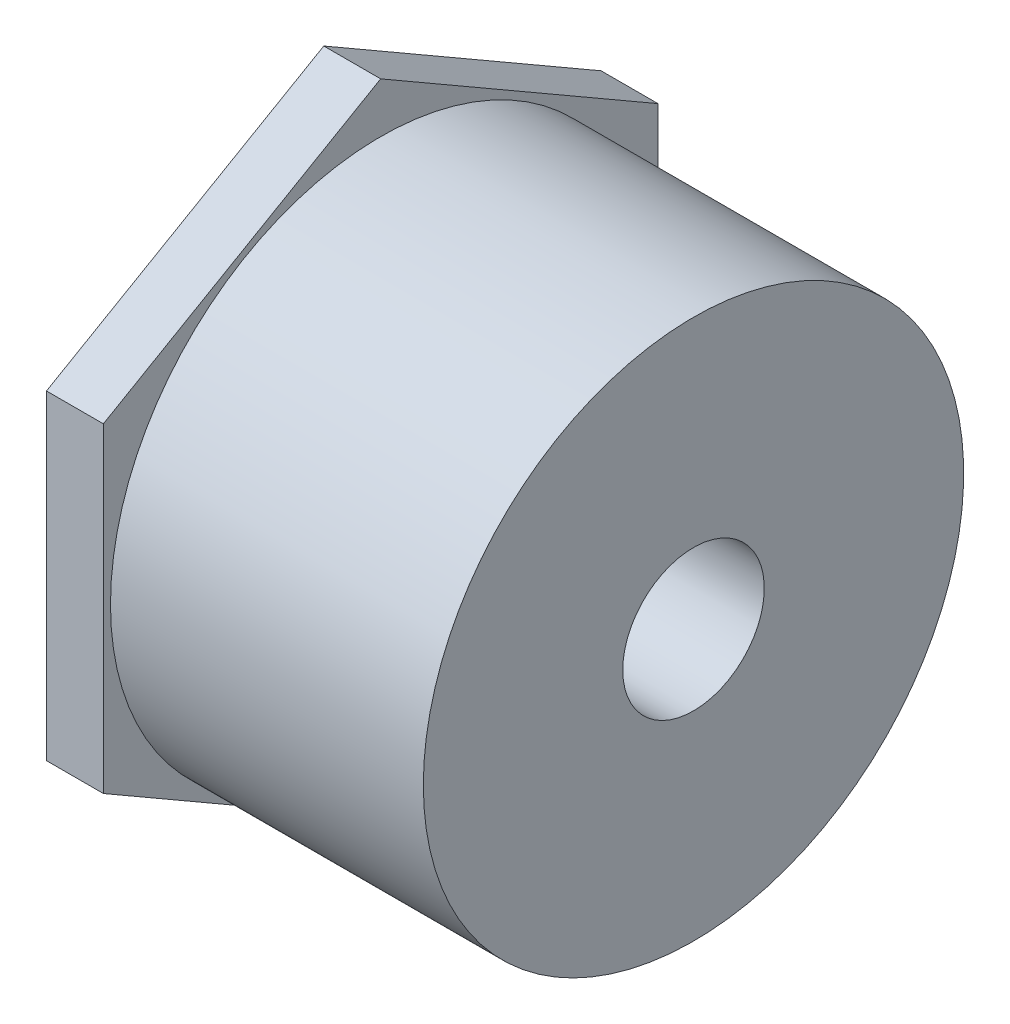
ISO-10303-21;
HEADER;
FILE_DESCRIPTION(('STEP AP214'),'2;1');
FILE_NAME('part.step','',(''),(''),'','','');
FILE_SCHEMA(('AUTOMOTIVE_DESIGN { 1 0 10303 214 1 1 1 1 }'));
ENDSEC;
DATA;
#1=APPLICATION_CONTEXT('core data for automotive mechanical design processes');
#2=APPLICATION_PROTOCOL_DEFINITION('international standard','automotive_design',2000,#1);
#3=PRODUCT_CONTEXT('',#1,'mechanical');
#4=PRODUCT('Part','Part','',(#3));
#5=PRODUCT_RELATED_PRODUCT_CATEGORY('part','',(#4));
#6=PRODUCT_DEFINITION_FORMATION('','',#4);
#7=PRODUCT_DEFINITION_CONTEXT('part definition',#1,'design');
#8=PRODUCT_DEFINITION('design','',#6,#7);
#9=PRODUCT_DEFINITION_SHAPE('','',#8);
#10=(LENGTH_UNIT() NAMED_UNIT(*) SI_UNIT(.MILLI.,.METRE.));
#11=(NAMED_UNIT(*) PLANE_ANGLE_UNIT() SI_UNIT($,.RADIAN.));
#12=(NAMED_UNIT(*) SI_UNIT($,.STERADIAN.) SOLID_ANGLE_UNIT());
#13=UNCERTAINTY_MEASURE_WITH_UNIT(LENGTH_MEASURE(1.E-05),#10,'distance_accuracy_value','');
#14=(GEOMETRIC_REPRESENTATION_CONTEXT(3) GLOBAL_UNCERTAINTY_ASSIGNED_CONTEXT((#13)) GLOBAL_UNIT_ASSIGNED_CONTEXT((#10,
#11,#12)) REPRESENTATION_CONTEXT('',''));
#15=CARTESIAN_POINT('',(0.,0.,0.));
#16=DIRECTION('',(0.,0.,1.));
#17=DIRECTION('',(1.,0.,0.));
#18=AXIS2_PLACEMENT_3D('',#15,#16,#17);
#19=CARTESIAN_POINT('',(-41.275,0.,0.));
#20=DIRECTION('',(-1.,0.,0.));
#21=DIRECTION('',(0.,0.,1.));
#22=AXIS2_PLACEMENT_3D('',#19,#20,#21);
#23=CYLINDRICAL_SURFACE('',#22,30.1625);
#24=CARTESIAN_POINT('',(0.,0.,0.));
#25=DIRECTION('',(-1.,0.,0.));
#26=DIRECTION('',(0.,0.,1.));
#27=AXIS2_PLACEMENT_3D('',#24,#25,#26);
#28=CIRCLE('',#27,30.1625);
#29=CARTESIAN_POINT('',(0.,0.,30.1625));
#30=VERTEX_POINT('',#29);
#31=EDGE_CURVE('E143',#30,#30,#28,.T.);
#32=ORIENTED_EDGE('',*,*,#31,.T.);
#33=EDGE_LOOP('',(#32));
#34=FACE_BOUND('',#33,.T.);
#35=CARTESIAN_POINT('',(-34.925,0.,0.));
#36=DIRECTION('',(-1.,0.,0.));
#37=DIRECTION('',(0.,0.,1.));
#38=AXIS2_PLACEMENT_3D('',#35,#36,#37);
#39=CIRCLE('',#38,30.1625);
#40=CARTESIAN_POINT('',(-34.925,0.,30.1625));
#41=VERTEX_POINT('',#40);
#42=EDGE_CURVE('E36',#41,#41,#39,.F.);
#43=ORIENTED_EDGE('',*,*,#42,.T.);
#44=EDGE_LOOP('',(#43));
#45=FACE_BOUND('',#44,.T.);
#46=ADVANCED_FACE('F32',(#34,#45),#23,.T.);
#47=CARTESIAN_POINT('',(-41.275,-30.1625,0.));
#48=DIRECTION('',(-1.,0.,0.));
#49=DIRECTION('',(0.,0.,1.));
#50=AXIS2_PLACEMENT_3D('',#47,#48,#49);
#51=PLANE('',#50);
#52=CARTESIAN_POINT('',(-41.275,0.,0.));
#53=DIRECTION('',(-1.,0.,0.));
#54=DIRECTION('',(0.,0.,1.));
#55=AXIS2_PLACEMENT_3D('',#52,#53,#54);
#56=CIRCLE('',#55,10.7696);
#57=CARTESIAN_POINT('',(-41.275,0.,10.7696));
#58=VERTEX_POINT('',#57);
#59=EDGE_CURVE('E11',#58,#58,#56,.T.);
#60=ORIENTED_EDGE('',*,*,#59,.F.);
#61=EDGE_LOOP('',(#60));
#62=FACE_BOUND('',#61,.T.);
#63=DIRECTION('',(0.,0.5,-0.866025403784439));
#64=VECTOR('',#63,1.);
#65=CARTESIAN_POINT('',(-41.275,17.8725992706013,30.9562500000001));
#66=LINE('',#65,#64);
#67=CARTESIAN_POINT('',(-41.275,17.8725992706013,30.9562500000001));
#68=VERTEX_POINT('',#67);
#69=CARTESIAN_POINT('',(-41.275,35.7451985412027,0.));
#70=VERTEX_POINT('',#69);
#71=EDGE_CURVE('E121',#68,#70,#66,.T.);
#72=ORIENTED_EDGE('',*,*,#71,.T.);
#73=DIRECTION('',(0.,-0.5,-0.866025403784439));
#74=VECTOR('',#73,1.);
#75=CARTESIAN_POINT('',(-41.275,35.7451985412027,0.));
#76=LINE('',#75,#74);
#77=CARTESIAN_POINT('',(-41.275,17.8725992706014,-30.9562499999999));
#78=VERTEX_POINT('',#77);
#79=EDGE_CURVE('E124',#70,#78,#76,.T.);
#80=ORIENTED_EDGE('',*,*,#79,.T.);
#81=DIRECTION('',(0.,-1.,0.));
#82=VECTOR('',#81,1.);
#83=CARTESIAN_POINT('',(-41.275,17.8725992706014,-30.9562499999999));
#84=LINE('',#83,#82);
#85=CARTESIAN_POINT('',(-41.275,-17.8725992706013,-30.95625));
#86=VERTEX_POINT('',#85);
#87=EDGE_CURVE('E127',#78,#86,#84,.T.);
#88=ORIENTED_EDGE('',*,*,#87,.T.);
#89=DIRECTION('',(0.,-0.5,0.866025403784439));
#90=VECTOR('',#89,1.);
#91=CARTESIAN_POINT('',(-41.275,-17.8725992706013,-30.95625));
#92=LINE('',#91,#90);
#93=CARTESIAN_POINT('',(-41.275,-35.7451985412027,0.));
#94=VERTEX_POINT('',#93);
#95=EDGE_CURVE('E130',#86,#94,#92,.T.);
#96=ORIENTED_EDGE('',*,*,#95,.T.);
#97=DIRECTION('',(0.,0.5,0.866025403784439));
#98=VECTOR('',#97,1.);
#99=CARTESIAN_POINT('',(-41.275,-35.7451985412027,0.));
#100=LINE('',#99,#98);
#101=CARTESIAN_POINT('',(-41.275,-17.8725992706014,30.95625));
#102=VERTEX_POINT('',#101);
#103=EDGE_CURVE('E98',#94,#102,#100,.T.);
#104=ORIENTED_EDGE('',*,*,#103,.T.);
#105=DIRECTION('',(0.,1.,0.));
#106=VECTOR('',#105,1.);
#107=CARTESIAN_POINT('',(-41.275,-17.8725992706014,30.95625));
#108=LINE('',#107,#106);
#109=EDGE_CURVE('E133',#102,#68,#108,.T.);
#110=ORIENTED_EDGE('',*,*,#109,.T.);
#111=EDGE_LOOP('',(#72,#80,#88,#96,#104,#110));
#112=FACE_BOUND('',#111,.T.);
#113=ADVANCED_FACE('F34',(#62,#112),#51,.T.);
#114=CARTESIAN_POINT('',(-22.225,0.,0.));
#115=DIRECTION('',(-1.,0.,0.));
#116=DIRECTION('',(0.,0.,1.));
#117=AXIS2_PLACEMENT_3D('',#114,#115,#116);
#118=CONICAL_SURFACE('',#117,10.6172,0.00799982933988666);
#119=ORIENTED_EDGE('',*,*,#59,.T.);
#120=EDGE_LOOP('',(#119));
#121=FACE_BOUND('',#120,.T.);
#122=CARTESIAN_POINT('',(-22.225,0.,0.));
#123=DIRECTION('',(-1.,0.,0.));
#124=DIRECTION('',(0.,0.,1.));
#125=AXIS2_PLACEMENT_3D('',#122,#123,#124);
#126=CIRCLE('',#125,10.6172);
#127=CARTESIAN_POINT('',(-22.225,0.,10.6172));
#128=VERTEX_POINT('',#127);
#129=EDGE_CURVE('E42',#128,#128,#126,.T.);
#130=ORIENTED_EDGE('',*,*,#129,.F.);
#131=EDGE_LOOP('',(#130));
#132=FACE_BOUND('',#131,.T.);
#133=ADVANCED_FACE('F158',(#121,#132),#118,.F.);
#134=CARTESIAN_POINT('',(-22.225,-7.8994,0.));
#135=DIRECTION('',(-1.,0.,0.));
#136=DIRECTION('',(0.,0.,1.));
#137=AXIS2_PLACEMENT_3D('',#134,#135,#136);
#138=PLANE('',#137);
#139=ORIENTED_EDGE('',*,*,#129,.T.);
#140=EDGE_LOOP('',(#139));
#141=FACE_BOUND('',#140,.T.);
#142=CARTESIAN_POINT('',(-22.225,0.,0.));
#143=DIRECTION('',(-1.,0.,0.));
#144=DIRECTION('',(0.,0.,1.));
#145=AXIS2_PLACEMENT_3D('',#142,#143,#144);
#146=CIRCLE('',#145,7.8994);
#147=CARTESIAN_POINT('',(-22.225,0.,7.8994));
#148=VERTEX_POINT('',#147);
#149=EDGE_CURVE('E149',#148,#148,#146,.T.);
#150=ORIENTED_EDGE('',*,*,#149,.F.);
#151=EDGE_LOOP('',(#150));
#152=FACE_BOUND('',#151,.T.);
#153=ADVANCED_FACE('F155',(#141,#152),#138,.T.);
#154=CARTESIAN_POINT('',(-41.275,0.,0.));
#155=DIRECTION('',(-1.,0.,0.));
#156=DIRECTION('',(0.,0.,1.));
#157=AXIS2_PLACEMENT_3D('',#154,#155,#156);
#158=CYLINDRICAL_SURFACE('',#157,7.8994);
#159=ORIENTED_EDGE('',*,*,#149,.T.);
#160=EDGE_LOOP('',(#159));
#161=FACE_BOUND('',#160,.T.);
#162=CARTESIAN_POINT('',(0.,0.,0.));
#163=DIRECTION('',(-1.,0.,0.));
#164=DIRECTION('',(0.,0.,1.));
#165=AXIS2_PLACEMENT_3D('',#162,#163,#164);
#166=CIRCLE('',#165,7.8994);
#167=CARTESIAN_POINT('',(0.,0.,7.8994));
#168=VERTEX_POINT('',#167);
#169=EDGE_CURVE('E146',#168,#168,#166,.T.);
#170=ORIENTED_EDGE('',*,*,#169,.F.);
#171=EDGE_LOOP('',(#170));
#172=FACE_BOUND('',#171,.T.);
#173=ADVANCED_FACE('F165',(#161,#172),#158,.F.);
#174=CARTESIAN_POINT('',(0.,-7.8994,0.));
#175=DIRECTION('',(1.,0.,0.));
#176=DIRECTION('',(0.,0.,-1.));
#177=AXIS2_PLACEMENT_3D('',#174,#175,#176);
#178=PLANE('',#177);
#179=ORIENTED_EDGE('',*,*,#169,.T.);
#180=EDGE_LOOP('',(#179));
#181=FACE_BOUND('',#180,.T.);
#182=ORIENTED_EDGE('',*,*,#31,.F.);
#183=EDGE_LOOP('',(#182));
#184=FACE_BOUND('',#183,.T.);
#185=ADVANCED_FACE('F178',(#181,#184),#178,.T.);
#186=CARTESIAN_POINT('',(-34.925,17.8725992706013,30.95625));
#187=DIRECTION('',(0.,0.866025403784439,0.5));
#188=DIRECTION('',(0.,-0.5,0.866025403784439));
#189=AXIS2_PLACEMENT_3D('',#186,#187,#188);
#190=PLANE('',#189);
#191=ORIENTED_EDGE('',*,*,#71,.F.);
#192=DIRECTION('',(-1.,0.,0.));
#193=VECTOR('',#192,1.);
#194=CARTESIAN_POINT('',(-34.925,17.8725992706013,30.95625));
#195=LINE('',#194,#193);
#196=CARTESIAN_POINT('',(-34.925,17.8725992706013,30.95625));
#197=VERTEX_POINT('',#196);
#198=EDGE_CURVE('E50',#197,#68,#195,.T.);
#199=ORIENTED_EDGE('',*,*,#198,.F.);
#200=DIRECTION('',(0.,0.5,-0.866025403784439));
#201=VECTOR('',#200,1.);
#202=CARTESIAN_POINT('',(-34.925,17.8725992706013,30.95625));
#203=LINE('',#202,#201);
#204=CARTESIAN_POINT('',(-34.925,35.7451985412027,0.));
#205=VERTEX_POINT('',#204);
#206=EDGE_CURVE('E136',#197,#205,#203,.T.);
#207=ORIENTED_EDGE('',*,*,#206,.T.);
#208=DIRECTION('',(-1.,0.,0.));
#209=VECTOR('',#208,1.);
#210=CARTESIAN_POINT('',(-34.925,35.7451985412027,0.));
#211=LINE('',#210,#209);
#212=EDGE_CURVE('E85',#205,#70,#211,.T.);
#213=ORIENTED_EDGE('',*,*,#212,.T.);
#214=EDGE_LOOP('',(#191,#199,#207,#213));
#215=FACE_BOUND('',#214,.T.);
#216=ADVANCED_FACE('F176',(#215),#190,.T.);
#217=CARTESIAN_POINT('',(-34.925,-17.8725992706014,30.9562500000001));
#218=DIRECTION('',(0.,0.,1.));
#219=DIRECTION('',(0.,-1.,0.));
#220=AXIS2_PLACEMENT_3D('',#217,#218,#219);
#221=PLANE('',#220);
#222=ORIENTED_EDGE('',*,*,#109,.F.);
#223=DIRECTION('',(-1.,0.,0.));
#224=VECTOR('',#223,1.);
#225=CARTESIAN_POINT('',(-34.925,-17.8725992706014,30.9562500000001));
#226=LINE('',#225,#224);
#227=CARTESIAN_POINT('',(-34.925,-17.8725992706014,30.9562500000001));
#228=VERTEX_POINT('',#227);
#229=EDGE_CURVE('E73',#228,#102,#226,.T.);
#230=ORIENTED_EDGE('',*,*,#229,.F.);
#231=DIRECTION('',(0.,1.,0.));
#232=VECTOR('',#231,1.);
#233=CARTESIAN_POINT('',(-34.925,-17.8725992706014,30.9562500000001));
#234=LINE('',#233,#232);
#235=EDGE_CURVE('E111',#228,#197,#234,.T.);
#236=ORIENTED_EDGE('',*,*,#235,.T.);
#237=ORIENTED_EDGE('',*,*,#198,.T.);
#238=EDGE_LOOP('',(#222,#230,#236,#237));
#239=FACE_BOUND('',#238,.T.);
#240=ADVANCED_FACE('F203',(#239),#221,.T.);
#241=CARTESIAN_POINT('',(-34.925,-35.7451985412027,0.));
#242=DIRECTION('',(0.,-0.866025403784438,0.5));
#243=DIRECTION('',(0.,-0.5,-0.866025403784439));
#244=AXIS2_PLACEMENT_3D('',#241,#242,#243);
#245=PLANE('',#244);
#246=ORIENTED_EDGE('',*,*,#103,.F.);
#247=DIRECTION('',(-1.,0.,0.));
#248=VECTOR('',#247,1.);
#249=CARTESIAN_POINT('',(-34.925,-35.7451985412027,0.));
#250=LINE('',#249,#248);
#251=CARTESIAN_POINT('',(-34.925,-35.7451985412027,0.));
#252=VERTEX_POINT('',#251);
#253=EDGE_CURVE('E93',#252,#94,#250,.T.);
#254=ORIENTED_EDGE('',*,*,#253,.F.);
#255=DIRECTION('',(0.,0.5,0.866025403784439));
#256=VECTOR('',#255,1.);
#257=CARTESIAN_POINT('',(-34.925,-35.7451985412027,0.));
#258=LINE('',#257,#256);
#259=EDGE_CURVE('E96',#252,#228,#258,.T.);
#260=ORIENTED_EDGE('',*,*,#259,.T.);
#261=ORIENTED_EDGE('',*,*,#229,.T.);
#262=EDGE_LOOP('',(#246,#254,#260,#261));
#263=FACE_BOUND('',#262,.T.);
#264=ADVANCED_FACE('F95',(#263),#245,.T.);
#265=CARTESIAN_POINT('',(-34.925,-17.8725992706013,-30.9562499999999));
#266=DIRECTION('',(0.,-0.866025403784438,-0.5));
#267=DIRECTION('',(0.,0.5,-0.866025403784439));
#268=AXIS2_PLACEMENT_3D('',#265,#266,#267);
#269=PLANE('',#268);
#270=ORIENTED_EDGE('',*,*,#95,.F.);
#271=DIRECTION('',(-1.,0.,0.));
#272=VECTOR('',#271,1.);
#273=CARTESIAN_POINT('',(-34.925,-17.8725992706013,-30.9562499999999));
#274=LINE('',#273,#272);
#275=CARTESIAN_POINT('',(-34.925,-17.8725992706013,-30.9562499999999));
#276=VERTEX_POINT('',#275);
#277=EDGE_CURVE('E103',#276,#86,#274,.T.);
#278=ORIENTED_EDGE('',*,*,#277,.F.);
#279=DIRECTION('',(0.,-0.5,0.866025403784439));
#280=VECTOR('',#279,1.);
#281=CARTESIAN_POINT('',(-34.925,-17.8725992706013,-30.9562499999999));
#282=LINE('',#281,#280);
#283=EDGE_CURVE('E109',#276,#252,#282,.T.);
#284=ORIENTED_EDGE('',*,*,#283,.T.);
#285=ORIENTED_EDGE('',*,*,#253,.T.);
#286=EDGE_LOOP('',(#270,#278,#284,#285));
#287=FACE_BOUND('',#286,.T.);
#288=ADVANCED_FACE('F113',(#287),#269,.T.);
#289=CARTESIAN_POINT('',(-34.925,17.8725992706014,-30.95625));
#290=DIRECTION('',(0.,0.,-1.));
#291=DIRECTION('',(0.,1.,0.));
#292=AXIS2_PLACEMENT_3D('',#289,#290,#291);
#293=PLANE('',#292);
#294=ORIENTED_EDGE('',*,*,#87,.F.);
#295=DIRECTION('',(-1.,0.,0.));
#296=VECTOR('',#295,1.);
#297=CARTESIAN_POINT('',(-34.925,17.8725992706014,-30.95625));
#298=LINE('',#297,#296);
#299=CARTESIAN_POINT('',(-34.925,17.8725992706014,-30.95625));
#300=VERTEX_POINT('',#299);
#301=EDGE_CURVE('E140',#300,#78,#298,.T.);
#302=ORIENTED_EDGE('',*,*,#301,.F.);
#303=DIRECTION('',(0.,-1.,0.));
#304=VECTOR('',#303,1.);
#305=CARTESIAN_POINT('',(-34.925,17.8725992706014,-30.95625));
#306=LINE('',#305,#304);
#307=EDGE_CURVE('E114',#300,#276,#306,.T.);
#308=ORIENTED_EDGE('',*,*,#307,.T.);
#309=ORIENTED_EDGE('',*,*,#277,.T.);
#310=EDGE_LOOP('',(#294,#302,#308,#309));
#311=FACE_BOUND('',#310,.T.);
#312=ADVANCED_FACE('F221',(#311),#293,.T.);
#313=CARTESIAN_POINT('',(-34.925,35.7451985412027,0.));
#314=DIRECTION('',(0.,0.866025403784439,-0.5));
#315=DIRECTION('',(0.,0.5,0.866025403784439));
#316=AXIS2_PLACEMENT_3D('',#313,#314,#315);
#317=PLANE('',#316);
#318=ORIENTED_EDGE('',*,*,#79,.F.);
#319=ORIENTED_EDGE('',*,*,#212,.F.);
#320=DIRECTION('',(0.,-0.5,-0.866025403784439));
#321=VECTOR('',#320,1.);
#322=CARTESIAN_POINT('',(-34.925,35.7451985412027,0.));
#323=LINE('',#322,#321);
#324=EDGE_CURVE('E116',#205,#300,#323,.T.);
#325=ORIENTED_EDGE('',*,*,#324,.T.);
#326=ORIENTED_EDGE('',*,*,#301,.T.);
#327=EDGE_LOOP('',(#318,#319,#325,#326));
#328=FACE_BOUND('',#327,.T.);
#329=ADVANCED_FACE('F228',(#328),#317,.T.);
#330=CARTESIAN_POINT('',(-34.925,35.7451985412027,0.));
#331=DIRECTION('',(-1.,0.,0.));
#332=DIRECTION('',(0.,0.,1.));
#333=AXIS2_PLACEMENT_3D('',#330,#331,#332);
#334=PLANE('',#333);
#335=ORIENTED_EDGE('',*,*,#42,.F.);
#336=EDGE_LOOP('',(#335));
#337=FACE_BOUND('',#336,.T.);
#338=ORIENTED_EDGE('',*,*,#206,.F.);
#339=ORIENTED_EDGE('',*,*,#235,.F.);
#340=ORIENTED_EDGE('',*,*,#259,.F.);
#341=ORIENTED_EDGE('',*,*,#283,.F.);
#342=ORIENTED_EDGE('',*,*,#307,.F.);
#343=ORIENTED_EDGE('',*,*,#324,.F.);
#344=EDGE_LOOP('',(#338,#339,#340,#341,#342,#343));
#345=FACE_BOUND('',#344,.T.);
#346=ADVANCED_FACE('F107',(#337,#345),#334,.F.);
#347=CLOSED_SHELL('',(#46,#113,#133,#153,#173,#185,#216,#240,#264,#288,#312,#329,#346));
#348=MANIFOLD_SOLID_BREP('B2',#347);
#349=ADVANCED_BREP_SHAPE_REPRESENTATION('',(#18,#348),#14);
#350=SHAPE_DEFINITION_REPRESENTATION(#9,#349);
ENDSEC;
END-ISO-10303-21;
